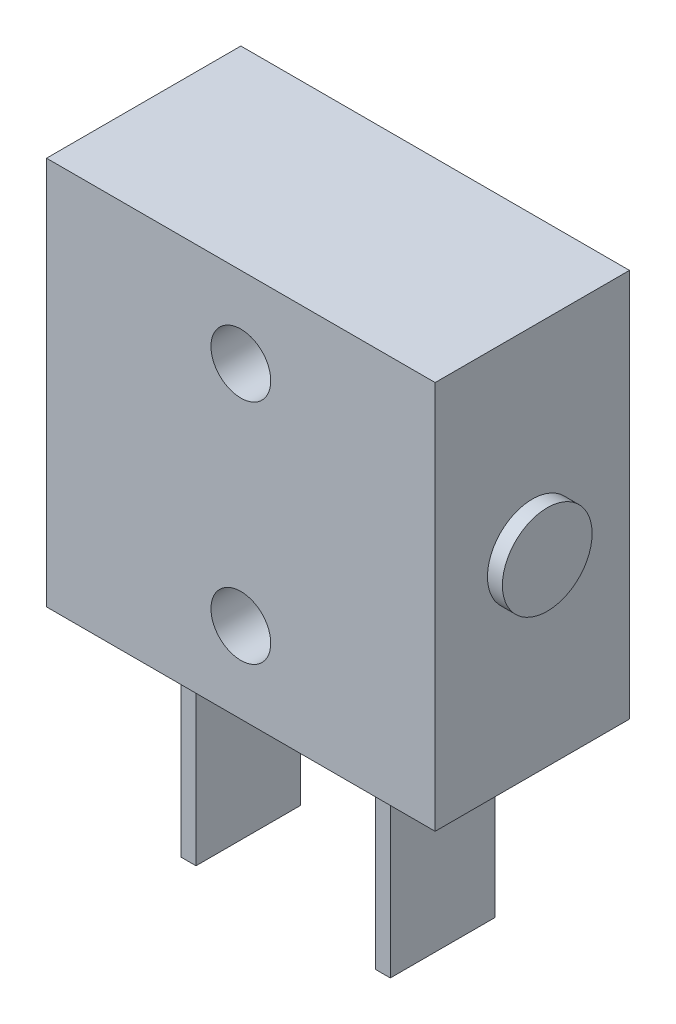
ISO-10303-21;
HEADER;
FILE_DESCRIPTION(('STEP AP214'),'2;1');
FILE_NAME('part.step','',(''),(''),'','','');
FILE_SCHEMA(('AUTOMOTIVE_DESIGN { 1 0 10303 214 1 1 1 1 }'));
ENDSEC;
DATA;
#1=APPLICATION_CONTEXT('core data for automotive mechanical design processes');
#2=APPLICATION_PROTOCOL_DEFINITION('international standard','automotive_design',2000,#1);
#3=PRODUCT_CONTEXT('',#1,'mechanical');
#4=PRODUCT('Part','Part','',(#3));
#5=PRODUCT_RELATED_PRODUCT_CATEGORY('part','',(#4));
#6=PRODUCT_DEFINITION_FORMATION('','',#4);
#7=PRODUCT_DEFINITION_CONTEXT('part definition',#1,'design');
#8=PRODUCT_DEFINITION('design','',#6,#7);
#9=PRODUCT_DEFINITION_SHAPE('','',#8);
#10=(LENGTH_UNIT() NAMED_UNIT(*) SI_UNIT(.MILLI.,.METRE.));
#11=(NAMED_UNIT(*) PLANE_ANGLE_UNIT() SI_UNIT($,.RADIAN.));
#12=(NAMED_UNIT(*) SI_UNIT($,.STERADIAN.) SOLID_ANGLE_UNIT());
#13=UNCERTAINTY_MEASURE_WITH_UNIT(LENGTH_MEASURE(1.E-05),#10,'distance_accuracy_value','');
#14=(GEOMETRIC_REPRESENTATION_CONTEXT(3) GLOBAL_UNCERTAINTY_ASSIGNED_CONTEXT((#13)) GLOBAL_UNIT_ASSIGNED_CONTEXT((#10,
#11,#12)) REPRESENTATION_CONTEXT('',''));
#15=CARTESIAN_POINT('',(0.,0.,0.));
#16=DIRECTION('',(0.,0.,1.));
#17=DIRECTION('',(1.,0.,0.));
#18=AXIS2_PLACEMENT_3D('',#15,#16,#17);
#19=CARTESIAN_POINT('',(-6.5,-6.5,6.5));
#20=DIRECTION('',(0.,1.,0.));
#21=DIRECTION('',(0.,0.,1.));
#22=AXIS2_PLACEMENT_3D('',#19,#20,#21);
#23=PLANE('',#22);
#24=DIRECTION('',(0.,0.,1.));
#25=VECTOR('',#24,1.);
#26=CARTESIAN_POINT('',(-3.,-6.5,5.));
#27=LINE('',#26,#25);
#28=CARTESIAN_POINT('',(-3.,-6.5,1.5));
#29=VERTEX_POINT('',#28);
#30=CARTESIAN_POINT('',(-3.,-6.5,5.));
#31=VERTEX_POINT('',#30);
#32=EDGE_CURVE('E147',#29,#31,#27,.T.);
#33=ORIENTED_EDGE('',*,*,#32,.F.);
#34=DIRECTION('',(1.,0.,0.));
#35=VECTOR('',#34,1.);
#36=CARTESIAN_POINT('',(-3.5,-6.5,1.5));
#37=LINE('',#36,#35);
#38=CARTESIAN_POINT('',(-3.5,-6.5,1.5));
#39=VERTEX_POINT('',#38);
#40=EDGE_CURVE('E160',#39,#29,#37,.T.);
#41=ORIENTED_EDGE('',*,*,#40,.F.);
#42=DIRECTION('',(0.,0.,-1.));
#43=VECTOR('',#42,1.);
#44=CARTESIAN_POINT('',(-3.5,-6.5,5.));
#45=LINE('',#44,#43);
#46=CARTESIAN_POINT('',(-3.5,-6.5,5.));
#47=VERTEX_POINT('',#46);
#48=EDGE_CURVE('E169',#47,#39,#45,.T.);
#49=ORIENTED_EDGE('',*,*,#48,.F.);
#50=DIRECTION('',(-1.,0.,0.));
#51=VECTOR('',#50,1.);
#52=CARTESIAN_POINT('',(-3.5,-6.5,5.));
#53=LINE('',#52,#51);
#54=EDGE_CURVE('E150',#31,#47,#53,.T.);
#55=ORIENTED_EDGE('',*,*,#54,.F.);
#56=EDGE_LOOP('',(#33,#41,#49,#55));
#57=FACE_BOUND('',#56,.T.);
#58=DIRECTION('',(1.,0.,0.));
#59=VECTOR('',#58,1.);
#60=CARTESIAN_POINT('',(-6.5,-6.5,0.));
#61=LINE('',#60,#59);
#62=CARTESIAN_POINT('',(-6.5,-6.5,0.));
#63=VERTEX_POINT('',#62);
#64=CARTESIAN_POINT('',(6.5,-6.5,0.));
#65=VERTEX_POINT('',#64);
#66=EDGE_CURVE('E190',#63,#65,#61,.T.);
#67=ORIENTED_EDGE('',*,*,#66,.T.);
#68=DIRECTION('',(0.,0.,-1.));
#69=VECTOR('',#68,1.);
#70=CARTESIAN_POINT('',(6.5,-6.5,6.5));
#71=LINE('',#70,#69);
#72=CARTESIAN_POINT('',(6.5,-6.5,6.5));
#73=VERTEX_POINT('',#72);
#74=EDGE_CURVE('E196',#73,#65,#71,.T.);
#75=ORIENTED_EDGE('',*,*,#74,.F.);
#76=DIRECTION('',(1.,0.,0.));
#77=VECTOR('',#76,1.);
#78=CARTESIAN_POINT('',(-6.5,-6.5,6.5));
#79=LINE('',#78,#77);
#80=CARTESIAN_POINT('',(-6.5,-6.5,6.5));
#81=VERTEX_POINT('',#80);
#82=EDGE_CURVE('E194',#81,#73,#79,.T.);
#83=ORIENTED_EDGE('',*,*,#82,.F.);
#84=DIRECTION('',(0.,0.,-1.));
#85=VECTOR('',#84,1.);
#86=CARTESIAN_POINT('',(-6.5,-6.5,6.5));
#87=LINE('',#86,#85);
#88=EDGE_CURVE('E206',#81,#63,#87,.T.);
#89=ORIENTED_EDGE('',*,*,#88,.T.);
#90=EDGE_LOOP('',(#67,#75,#83,#89));
#91=FACE_BOUND('',#90,.T.);
#92=DIRECTION('',(0.,0.,1.));
#93=VECTOR('',#92,1.);
#94=CARTESIAN_POINT('',(3.5,-6.5,5.));
#95=LINE('',#94,#93);
#96=CARTESIAN_POINT('',(3.5,-6.5,1.5));
#97=VERTEX_POINT('',#96);
#98=CARTESIAN_POINT('',(3.5,-6.5,5.));
#99=VERTEX_POINT('',#98);
#100=EDGE_CURVE('E146',#97,#99,#95,.T.);
#101=ORIENTED_EDGE('',*,*,#100,.F.);
#102=DIRECTION('',(1.,0.,0.));
#103=VECTOR('',#102,1.);
#104=CARTESIAN_POINT('',(3.5,-6.5,1.5));
#105=LINE('',#104,#103);
#106=CARTESIAN_POINT('',(3.,-6.5,1.5));
#107=VERTEX_POINT('',#106);
#108=EDGE_CURVE('E143',#107,#97,#105,.T.);
#109=ORIENTED_EDGE('',*,*,#108,.F.);
#110=DIRECTION('',(0.,0.,-1.));
#111=VECTOR('',#110,1.);
#112=CARTESIAN_POINT('',(3.,-6.5,5.));
#113=LINE('',#112,#111);
#114=CARTESIAN_POINT('',(3.,-6.5,5.));
#115=VERTEX_POINT('',#114);
#116=EDGE_CURVE('E57',#115,#107,#113,.T.);
#117=ORIENTED_EDGE('',*,*,#116,.F.);
#118=DIRECTION('',(-1.,0.,0.));
#119=VECTOR('',#118,1.);
#120=CARTESIAN_POINT('',(3.5,-6.5,5.));
#121=LINE('',#120,#119);
#122=EDGE_CURVE('E52',#99,#115,#121,.T.);
#123=ORIENTED_EDGE('',*,*,#122,.F.);
#124=EDGE_LOOP('',(#101,#109,#117,#123));
#125=FACE_BOUND('',#124,.T.);
#126=ADVANCED_FACE('F37',(#57,#91,#125),#23,.F.);
#127=CARTESIAN_POINT('',(6.5,6.5,6.5));
#128=DIRECTION('',(-1.,0.,0.));
#129=DIRECTION('',(0.,-1.,0.));
#130=AXIS2_PLACEMENT_3D('',#127,#128,#129);
#131=PLANE('',#130);
#132=CARTESIAN_POINT('',(6.5,0.,3.25));
#133=DIRECTION('',(-1.,0.,0.));
#134=DIRECTION('',(0.,-1.,0.));
#135=AXIS2_PLACEMENT_3D('',#132,#133,#134);
#136=CIRCLE('',#135,1.5);
#137=CARTESIAN_POINT('',(6.5,-1.5,3.25));
#138=VERTEX_POINT('',#137);
#139=EDGE_CURVE('E11',#138,#138,#136,.F.);
#140=ORIENTED_EDGE('',*,*,#139,.F.);
#141=EDGE_LOOP('',(#140));
#142=FACE_BOUND('',#141,.T.);
#143=DIRECTION('',(0.,1.,0.));
#144=VECTOR('',#143,1.);
#145=CARTESIAN_POINT('',(6.5,6.5,0.));
#146=LINE('',#145,#144);
#147=CARTESIAN_POINT('',(6.5,6.5,0.));
#148=VERTEX_POINT('',#147);
#149=EDGE_CURVE('E185',#65,#148,#146,.T.);
#150=ORIENTED_EDGE('',*,*,#149,.T.);
#151=DIRECTION('',(0.,0.,-1.));
#152=VECTOR('',#151,1.);
#153=CARTESIAN_POINT('',(6.5,6.5,6.5));
#154=LINE('',#153,#152);
#155=CARTESIAN_POINT('',(6.5,6.5,6.5));
#156=VERTEX_POINT('',#155);
#157=EDGE_CURVE('E45',#156,#148,#154,.T.);
#158=ORIENTED_EDGE('',*,*,#157,.F.);
#159=DIRECTION('',(0.,1.,0.));
#160=VECTOR('',#159,1.);
#161=CARTESIAN_POINT('',(6.5,6.5,6.5));
#162=LINE('',#161,#160);
#163=EDGE_CURVE('E186',#73,#156,#162,.T.);
#164=ORIENTED_EDGE('',*,*,#163,.F.);
#165=ORIENTED_EDGE('',*,*,#74,.T.);
#166=EDGE_LOOP('',(#150,#158,#164,#165));
#167=FACE_BOUND('',#166,.T.);
#168=ADVANCED_FACE('F39',(#142,#167),#131,.F.);
#169=CARTESIAN_POINT('',(-6.5,6.5,6.5));
#170=DIRECTION('',(0.,-1.,0.));
#171=DIRECTION('',(0.,0.,-1.));
#172=AXIS2_PLACEMENT_3D('',#169,#170,#171);
#173=PLANE('',#172);
#174=DIRECTION('',(-1.,0.,0.));
#175=VECTOR('',#174,1.);
#176=CARTESIAN_POINT('',(-6.5,6.5,0.));
#177=LINE('',#176,#175);
#178=CARTESIAN_POINT('',(-6.5,6.5,0.));
#179=VERTEX_POINT('',#178);
#180=EDGE_CURVE('E199',#148,#179,#177,.T.);
#181=ORIENTED_EDGE('',*,*,#180,.T.);
#182=DIRECTION('',(0.,0.,-1.));
#183=VECTOR('',#182,1.);
#184=CARTESIAN_POINT('',(-6.5,6.5,6.5));
#185=LINE('',#184,#183);
#186=CARTESIAN_POINT('',(-6.5,6.5,6.5));
#187=VERTEX_POINT('',#186);
#188=EDGE_CURVE('E209',#187,#179,#185,.T.);
#189=ORIENTED_EDGE('',*,*,#188,.F.);
#190=DIRECTION('',(-1.,0.,0.));
#191=VECTOR('',#190,1.);
#192=CARTESIAN_POINT('',(-6.5,6.5,6.5));
#193=LINE('',#192,#191);
#194=EDGE_CURVE('E189',#156,#187,#193,.T.);
#195=ORIENTED_EDGE('',*,*,#194,.F.);
#196=ORIENTED_EDGE('',*,*,#157,.T.);
#197=EDGE_LOOP('',(#181,#189,#195,#196));
#198=FACE_BOUND('',#197,.T.);
#199=ADVANCED_FACE('F214',(#198),#173,.F.);
#200=CARTESIAN_POINT('',(-6.5,6.5,6.5));
#201=DIRECTION('',(1.,0.,0.));
#202=DIRECTION('',(0.,1.,0.));
#203=AXIS2_PLACEMENT_3D('',#200,#201,#202);
#204=PLANE('',#203);
#205=DIRECTION('',(0.,-1.,0.));
#206=VECTOR('',#205,1.);
#207=CARTESIAN_POINT('',(-6.5,6.5,0.));
#208=LINE('',#207,#206);
#209=EDGE_CURVE('E201',#179,#63,#208,.T.);
#210=ORIENTED_EDGE('',*,*,#209,.T.);
#211=ORIENTED_EDGE('',*,*,#88,.F.);
#212=DIRECTION('',(0.,-1.,0.));
#213=VECTOR('',#212,1.);
#214=CARTESIAN_POINT('',(-6.5,6.5,6.5));
#215=LINE('',#214,#213);
#216=EDGE_CURVE('E192',#187,#81,#215,.T.);
#217=ORIENTED_EDGE('',*,*,#216,.F.);
#218=ORIENTED_EDGE('',*,*,#188,.T.);
#219=EDGE_LOOP('',(#210,#211,#217,#218));
#220=FACE_BOUND('',#219,.T.);
#221=ADVANCED_FACE('F226',(#220),#204,.F.);
#222=CARTESIAN_POINT('',(0.,0.,6.5));
#223=DIRECTION('',(0.,0.,1.));
#224=DIRECTION('',(1.,0.,0.));
#225=AXIS2_PLACEMENT_3D('',#222,#223,#224);
#226=PLANE('',#225);
#227=CARTESIAN_POINT('',(0.,-3.8,6.5));
#228=DIRECTION('',(0.,0.,1.));
#229=DIRECTION('',(-1.,0.,0.));
#230=AXIS2_PLACEMENT_3D('',#227,#228,#229);
#231=CIRCLE('',#230,1.);
#232=CARTESIAN_POINT('',(1.,-3.8,6.5));
#233=VERTEX_POINT('',#232);
#234=EDGE_CURVE('E414',#233,#233,#231,.T.);
#235=ORIENTED_EDGE('',*,*,#234,.F.);
#236=EDGE_LOOP('',(#235));
#237=FACE_BOUND('',#236,.T.);
#238=CARTESIAN_POINT('',(0.,3.8,6.5));
#239=DIRECTION('',(0.,0.,1.));
#240=DIRECTION('',(1.,0.,0.));
#241=AXIS2_PLACEMENT_3D('',#238,#239,#240);
#242=CIRCLE('',#241,1.);
#243=CARTESIAN_POINT('',(1.,3.8,6.5));
#244=VERTEX_POINT('',#243);
#245=EDGE_CURVE('E421',#244,#244,#242,.T.);
#246=ORIENTED_EDGE('',*,*,#245,.F.);
#247=EDGE_LOOP('',(#246));
#248=FACE_BOUND('',#247,.T.);
#249=ORIENTED_EDGE('',*,*,#163,.T.);
#250=ORIENTED_EDGE('',*,*,#194,.T.);
#251=ORIENTED_EDGE('',*,*,#216,.T.);
#252=ORIENTED_EDGE('',*,*,#82,.T.);
#253=EDGE_LOOP('',(#249,#250,#251,#252));
#254=FACE_BOUND('',#253,.T.);
#255=ADVANCED_FACE('F231',(#237,#248,#254),#226,.T.);
#256=CARTESIAN_POINT('',(0.,0.,0.));
#257=DIRECTION('',(0.,0.,1.));
#258=DIRECTION('',(1.,0.,0.));
#259=AXIS2_PLACEMENT_3D('',#256,#257,#258);
#260=PLANE('',#259);
#261=CARTESIAN_POINT('',(0.,-3.8,0.));
#262=DIRECTION('',(0.,0.,1.));
#263=DIRECTION('',(-1.,0.,0.));
#264=AXIS2_PLACEMENT_3D('',#261,#262,#263);
#265=CIRCLE('',#264,1.);
#266=CARTESIAN_POINT('',(1.,-3.8,0.));
#267=VERTEX_POINT('',#266);
#268=EDGE_CURVE('E417',#267,#267,#265,.T.);
#269=ORIENTED_EDGE('',*,*,#268,.T.);
#270=EDGE_LOOP('',(#269));
#271=FACE_BOUND('',#270,.T.);
#272=CARTESIAN_POINT('',(0.,3.8,0.));
#273=DIRECTION('',(0.,0.,1.));
#274=DIRECTION('',(1.,0.,0.));
#275=AXIS2_PLACEMENT_3D('',#272,#273,#274);
#276=CIRCLE('',#275,1.);
#277=CARTESIAN_POINT('',(1.,3.8,0.));
#278=VERTEX_POINT('',#277);
#279=EDGE_CURVE('E423',#278,#278,#276,.T.);
#280=ORIENTED_EDGE('',*,*,#279,.T.);
#281=EDGE_LOOP('',(#280));
#282=FACE_BOUND('',#281,.T.);
#283=ORIENTED_EDGE('',*,*,#149,.F.);
#284=ORIENTED_EDGE('',*,*,#66,.F.);
#285=ORIENTED_EDGE('',*,*,#209,.F.);
#286=ORIENTED_EDGE('',*,*,#180,.F.);
#287=EDGE_LOOP('',(#283,#284,#285,#286));
#288=FACE_BOUND('',#287,.T.);
#289=ADVANCED_FACE('F222',(#271,#282,#288),#260,.F.);
#290=CARTESIAN_POINT('',(-3.,-13.,5.));
#291=DIRECTION('',(-1.,0.,0.));
#292=DIRECTION('',(0.,0.,1.));
#293=AXIS2_PLACEMENT_3D('',#290,#291,#292);
#294=PLANE('',#293);
#295=ORIENTED_EDGE('',*,*,#32,.T.);
#296=DIRECTION('',(0.,1.,0.));
#297=VECTOR('',#296,1.);
#298=CARTESIAN_POINT('',(-3.,-13.,5.));
#299=LINE('',#298,#297);
#300=CARTESIAN_POINT('',(-3.,-13.,5.));
#301=VERTEX_POINT('',#300);
#302=EDGE_CURVE('E182',#301,#31,#299,.T.);
#303=ORIENTED_EDGE('',*,*,#302,.F.);
#304=DIRECTION('',(0.,0.,1.));
#305=VECTOR('',#304,1.);
#306=CARTESIAN_POINT('',(-3.,-13.,5.));
#307=LINE('',#306,#305);
#308=CARTESIAN_POINT('',(-3.,-13.,1.5));
#309=VERTEX_POINT('',#308);
#310=EDGE_CURVE('E156',#309,#301,#307,.T.);
#311=ORIENTED_EDGE('',*,*,#310,.F.);
#312=DIRECTION('',(0.,1.,0.));
#313=VECTOR('',#312,1.);
#314=CARTESIAN_POINT('',(-3.,-13.,1.5));
#315=LINE('',#314,#313);
#316=EDGE_CURVE('E165',#309,#29,#315,.T.);
#317=ORIENTED_EDGE('',*,*,#316,.T.);
#318=EDGE_LOOP('',(#295,#303,#311,#317));
#319=FACE_BOUND('',#318,.T.);
#320=ADVANCED_FACE('F239',(#319),#294,.F.);
#321=CARTESIAN_POINT('',(-3.5,-13.,5.));
#322=DIRECTION('',(0.,0.,-1.));
#323=DIRECTION('',(-1.,0.,0.));
#324=AXIS2_PLACEMENT_3D('',#321,#322,#323);
#325=PLANE('',#324);
#326=ORIENTED_EDGE('',*,*,#54,.T.);
#327=DIRECTION('',(0.,1.,0.));
#328=VECTOR('',#327,1.);
#329=CARTESIAN_POINT('',(-3.5,-13.,5.));
#330=LINE('',#329,#328);
#331=CARTESIAN_POINT('',(-3.5,-13.,5.));
#332=VERTEX_POINT('',#331);
#333=EDGE_CURVE('E179',#332,#47,#330,.T.);
#334=ORIENTED_EDGE('',*,*,#333,.F.);
#335=DIRECTION('',(-1.,0.,0.));
#336=VECTOR('',#335,1.);
#337=CARTESIAN_POINT('',(-3.5,-13.,5.));
#338=LINE('',#337,#336);
#339=EDGE_CURVE('E159',#301,#332,#338,.T.);
#340=ORIENTED_EDGE('',*,*,#339,.F.);
#341=ORIENTED_EDGE('',*,*,#302,.T.);
#342=EDGE_LOOP('',(#326,#334,#340,#341));
#343=FACE_BOUND('',#342,.T.);
#344=ADVANCED_FACE('F282',(#343),#325,.F.);
#345=CARTESIAN_POINT('',(-3.5,-13.,5.));
#346=DIRECTION('',(1.,0.,0.));
#347=DIRECTION('',(0.,0.,-1.));
#348=AXIS2_PLACEMENT_3D('',#345,#346,#347);
#349=PLANE('',#348);
#350=ORIENTED_EDGE('',*,*,#48,.T.);
#351=DIRECTION('',(0.,1.,0.));
#352=VECTOR('',#351,1.);
#353=CARTESIAN_POINT('',(-3.5,-13.,1.5));
#354=LINE('',#353,#352);
#355=CARTESIAN_POINT('',(-3.5,-13.,1.5));
#356=VERTEX_POINT('',#355);
#357=EDGE_CURVE('E176',#356,#39,#354,.T.);
#358=ORIENTED_EDGE('',*,*,#357,.F.);
#359=DIRECTION('',(0.,0.,-1.));
#360=VECTOR('',#359,1.);
#361=CARTESIAN_POINT('',(-3.5,-13.,5.));
#362=LINE('',#361,#360);
#363=EDGE_CURVE('E162',#332,#356,#362,.T.);
#364=ORIENTED_EDGE('',*,*,#363,.F.);
#365=ORIENTED_EDGE('',*,*,#333,.T.);
#366=EDGE_LOOP('',(#350,#358,#364,#365));
#367=FACE_BOUND('',#366,.T.);
#368=ADVANCED_FACE('F289',(#367),#349,.F.);
#369=CARTESIAN_POINT('',(-3.5,-13.,1.5));
#370=DIRECTION('',(0.,0.,1.));
#371=DIRECTION('',(1.,0.,0.));
#372=AXIS2_PLACEMENT_3D('',#369,#370,#371);
#373=PLANE('',#372);
#374=ORIENTED_EDGE('',*,*,#40,.T.);
#375=ORIENTED_EDGE('',*,*,#316,.F.);
#376=DIRECTION('',(1.,0.,0.));
#377=VECTOR('',#376,1.);
#378=CARTESIAN_POINT('',(-3.5,-13.,1.5));
#379=LINE('',#378,#377);
#380=EDGE_CURVE('E164',#356,#309,#379,.T.);
#381=ORIENTED_EDGE('',*,*,#380,.F.);
#382=ORIENTED_EDGE('',*,*,#357,.T.);
#383=EDGE_LOOP('',(#374,#375,#381,#382));
#384=FACE_BOUND('',#383,.T.);
#385=ADVANCED_FACE('F297',(#384),#373,.F.);
#386=CARTESIAN_POINT('',(0.,-13.,0.));
#387=DIRECTION('',(0.,-1.,0.));
#388=DIRECTION('',(0.,0.,-1.));
#389=AXIS2_PLACEMENT_3D('',#386,#387,#388);
#390=PLANE('',#389);
#391=ORIENTED_EDGE('',*,*,#310,.T.);
#392=ORIENTED_EDGE('',*,*,#339,.T.);
#393=ORIENTED_EDGE('',*,*,#363,.T.);
#394=ORIENTED_EDGE('',*,*,#380,.T.);
#395=EDGE_LOOP('',(#391,#392,#393,#394));
#396=FACE_BOUND('',#395,.T.);
#397=ADVANCED_FACE('F305',(#396),#390,.T.);
#398=CARTESIAN_POINT('',(3.5,-13.,5.));
#399=DIRECTION('',(-1.,0.,0.));
#400=DIRECTION('',(0.,0.,1.));
#401=AXIS2_PLACEMENT_3D('',#398,#399,#400);
#402=PLANE('',#401);
#403=ORIENTED_EDGE('',*,*,#100,.T.);
#404=DIRECTION('',(0.,1.,0.));
#405=VECTOR('',#404,1.);
#406=CARTESIAN_POINT('',(3.5,-13.,5.));
#407=LINE('',#406,#405);
#408=CARTESIAN_POINT('',(3.5,-13.,5.));
#409=VERTEX_POINT('',#408);
#410=EDGE_CURVE('E127',#409,#99,#407,.T.);
#411=ORIENTED_EDGE('',*,*,#410,.F.);
#412=DIRECTION('',(0.,0.,1.));
#413=VECTOR('',#412,1.);
#414=CARTESIAN_POINT('',(3.5,-13.,5.));
#415=LINE('',#414,#413);
#416=CARTESIAN_POINT('',(3.5,-13.,1.5));
#417=VERTEX_POINT('',#416);
#418=EDGE_CURVE('E134',#417,#409,#415,.T.);
#419=ORIENTED_EDGE('',*,*,#418,.F.);
#420=DIRECTION('',(0.,1.,0.));
#421=VECTOR('',#420,1.);
#422=CARTESIAN_POINT('',(3.5,-13.,1.5));
#423=LINE('',#422,#421);
#424=EDGE_CURVE('E430',#417,#97,#423,.T.);
#425=ORIENTED_EDGE('',*,*,#424,.T.);
#426=EDGE_LOOP('',(#403,#411,#419,#425));
#427=FACE_BOUND('',#426,.T.);
#428=ADVANCED_FACE('F145',(#427),#402,.F.);
#429=CARTESIAN_POINT('',(3.5,-13.,5.));
#430=DIRECTION('',(0.,0.,-1.));
#431=DIRECTION('',(-1.,0.,0.));
#432=AXIS2_PLACEMENT_3D('',#429,#430,#431);
#433=PLANE('',#432);
#434=ORIENTED_EDGE('',*,*,#122,.T.);
#435=DIRECTION('',(0.,1.,0.));
#436=VECTOR('',#435,1.);
#437=CARTESIAN_POINT('',(3.,-13.,5.));
#438=LINE('',#437,#436);
#439=CARTESIAN_POINT('',(3.,-13.,5.));
#440=VERTEX_POINT('',#439);
#441=EDGE_CURVE('E130',#440,#115,#438,.T.);
#442=ORIENTED_EDGE('',*,*,#441,.F.);
#443=DIRECTION('',(-1.,0.,0.));
#444=VECTOR('',#443,1.);
#445=CARTESIAN_POINT('',(3.5,-13.,5.));
#446=LINE('',#445,#444);
#447=EDGE_CURVE('E123',#409,#440,#446,.T.);
#448=ORIENTED_EDGE('',*,*,#447,.F.);
#449=ORIENTED_EDGE('',*,*,#410,.T.);
#450=EDGE_LOOP('',(#434,#442,#448,#449));
#451=FACE_BOUND('',#450,.T.);
#452=ADVANCED_FACE('F125',(#451),#433,.F.);
#453=CARTESIAN_POINT('',(3.,-13.,5.));
#454=DIRECTION('',(1.,0.,0.));
#455=DIRECTION('',(0.,0.,-1.));
#456=AXIS2_PLACEMENT_3D('',#453,#454,#455);
#457=PLANE('',#456);
#458=ORIENTED_EDGE('',*,*,#116,.T.);
#459=DIRECTION('',(0.,1.,0.));
#460=VECTOR('',#459,1.);
#461=CARTESIAN_POINT('',(3.,-13.,1.5));
#462=LINE('',#461,#460);
#463=CARTESIAN_POINT('',(3.,-13.,1.5));
#464=VERTEX_POINT('',#463);
#465=EDGE_CURVE('E152',#464,#107,#462,.T.);
#466=ORIENTED_EDGE('',*,*,#465,.F.);
#467=DIRECTION('',(0.,0.,-1.));
#468=VECTOR('',#467,1.);
#469=CARTESIAN_POINT('',(3.,-13.,5.));
#470=LINE('',#469,#468);
#471=EDGE_CURVE('E133',#440,#464,#470,.T.);
#472=ORIENTED_EDGE('',*,*,#471,.F.);
#473=ORIENTED_EDGE('',*,*,#441,.T.);
#474=EDGE_LOOP('',(#458,#466,#472,#473));
#475=FACE_BOUND('',#474,.T.);
#476=ADVANCED_FACE('F326',(#475),#457,.F.);
#477=CARTESIAN_POINT('',(3.5,-13.,1.5));
#478=DIRECTION('',(0.,0.,1.));
#479=DIRECTION('',(1.,0.,0.));
#480=AXIS2_PLACEMENT_3D('',#477,#478,#479);
#481=PLANE('',#480);
#482=ORIENTED_EDGE('',*,*,#108,.T.);
#483=ORIENTED_EDGE('',*,*,#424,.F.);
#484=DIRECTION('',(1.,0.,0.));
#485=VECTOR('',#484,1.);
#486=CARTESIAN_POINT('',(3.5,-13.,1.5));
#487=LINE('',#486,#485);
#488=EDGE_CURVE('E139',#464,#417,#487,.T.);
#489=ORIENTED_EDGE('',*,*,#488,.F.);
#490=ORIENTED_EDGE('',*,*,#465,.T.);
#491=EDGE_LOOP('',(#482,#483,#489,#490));
#492=FACE_BOUND('',#491,.T.);
#493=ADVANCED_FACE('F333',(#492),#481,.F.);
#494=CARTESIAN_POINT('',(0.,-13.,0.));
#495=DIRECTION('',(0.,1.,0.));
#496=DIRECTION('',(0.,0.,1.));
#497=AXIS2_PLACEMENT_3D('',#494,#495,#496);
#498=PLANE('',#497);
#499=ORIENTED_EDGE('',*,*,#418,.T.);
#500=ORIENTED_EDGE('',*,*,#447,.T.);
#501=ORIENTED_EDGE('',*,*,#471,.T.);
#502=ORIENTED_EDGE('',*,*,#488,.T.);
#503=EDGE_LOOP('',(#499,#500,#501,#502));
#504=FACE_BOUND('',#503,.T.);
#505=ADVANCED_FACE('F137',(#504),#498,.F.);
#506=CARTESIAN_POINT('',(0.,3.8,0.));
#507=DIRECTION('',(0.,0.,1.));
#508=DIRECTION('',(1.,0.,0.));
#509=AXIS2_PLACEMENT_3D('',#506,#507,#508);
#510=CYLINDRICAL_SURFACE('',#509,1.);
#511=CARTESIAN_POINT('',(1.,3.8,0.));
#512=CARTESIAN_POINT('',(1.,3.8,0.0677083333333332));
#513=CARTESIAN_POINT('',(1.,3.8,0.135416666666667));
#514=CARTESIAN_POINT('',(1.,3.8,0.270833333333333));
#515=CARTESIAN_POINT('',(1.,3.8,0.338541666666667));
#516=CARTESIAN_POINT('',(1.,3.8,0.473958333333333));
#517=CARTESIAN_POINT('',(1.,3.8,0.541666666666667));
#518=CARTESIAN_POINT('',(1.,3.8,0.677083333333333));
#519=CARTESIAN_POINT('',(1.,3.8,0.744791666666667));
#520=CARTESIAN_POINT('',(1.,3.8,0.880208333333333));
#521=CARTESIAN_POINT('',(1.,3.8,0.947916666666667));
#522=CARTESIAN_POINT('',(1.,3.8,1.08333333333333));
#523=CARTESIAN_POINT('',(1.,3.8,1.15104166666667));
#524=CARTESIAN_POINT('',(1.,3.8,1.28645833333333));
#525=CARTESIAN_POINT('',(1.,3.8,1.35416666666667));
#526=CARTESIAN_POINT('',(1.,3.8,1.48958333333333));
#527=CARTESIAN_POINT('',(1.,3.8,1.55729166666667));
#528=CARTESIAN_POINT('',(1.,3.8,1.69270833333333));
#529=CARTESIAN_POINT('',(1.,3.8,1.76041666666667));
#530=CARTESIAN_POINT('',(1.,3.8,1.89583333333333));
#531=CARTESIAN_POINT('',(1.,3.8,1.96354166666667));
#532=CARTESIAN_POINT('',(1.,3.8,2.09895833333333));
#533=CARTESIAN_POINT('',(1.,3.8,2.16666666666667));
#534=CARTESIAN_POINT('',(1.,3.8,2.30208333333333));
#535=CARTESIAN_POINT('',(1.,3.8,2.36979166666667));
#536=CARTESIAN_POINT('',(1.,3.8,2.50520833333333));
#537=CARTESIAN_POINT('',(1.,3.8,2.57291666666667));
#538=CARTESIAN_POINT('',(1.,3.8,2.70833333333333));
#539=CARTESIAN_POINT('',(1.,3.8,2.77604166666667));
#540=CARTESIAN_POINT('',(1.,3.8,2.91145833333333));
#541=CARTESIAN_POINT('',(1.,3.8,2.97916666666667));
#542=CARTESIAN_POINT('',(1.,3.8,3.11458333333333));
#543=CARTESIAN_POINT('',(1.,3.8,3.18229166666667));
#544=CARTESIAN_POINT('',(1.,3.8,3.31770833333333));
#545=CARTESIAN_POINT('',(1.,3.8,3.38541666666667));
#546=CARTESIAN_POINT('',(1.,3.8,3.52083333333333));
#547=CARTESIAN_POINT('',(1.,3.8,3.58854166666667));
#548=CARTESIAN_POINT('',(1.,3.8,3.72395833333333));
#549=CARTESIAN_POINT('',(1.,3.8,3.79166666666667));
#550=CARTESIAN_POINT('',(1.,3.8,3.92708333333333));
#551=CARTESIAN_POINT('',(1.,3.8,3.99479166666667));
#552=CARTESIAN_POINT('',(1.,3.8,4.13020833333333));
#553=CARTESIAN_POINT('',(1.,3.8,4.19791666666667));
#554=CARTESIAN_POINT('',(1.,3.8,4.33333333333333));
#555=CARTESIAN_POINT('',(1.,3.8,4.40104166666667));
#556=CARTESIAN_POINT('',(1.,3.8,4.53645833333333));
#557=CARTESIAN_POINT('',(1.,3.8,4.60416666666667));
#558=CARTESIAN_POINT('',(1.,3.8,4.73958333333333));
#559=CARTESIAN_POINT('',(1.,3.8,4.80729166666667));
#560=CARTESIAN_POINT('',(1.,3.8,4.94270833333333));
#561=CARTESIAN_POINT('',(1.,3.8,5.01041666666667));
#562=CARTESIAN_POINT('',(1.,3.8,5.14583333333333));
#563=CARTESIAN_POINT('',(1.,3.8,5.21354166666667));
#564=CARTESIAN_POINT('',(1.,3.8,5.34895833333333));
#565=CARTESIAN_POINT('',(1.,3.8,5.41666666666667));
#566=CARTESIAN_POINT('',(1.,3.8,5.55208333333333));
#567=CARTESIAN_POINT('',(1.,3.8,5.61979166666667));
#568=CARTESIAN_POINT('',(1.,3.8,5.75520833333333));
#569=CARTESIAN_POINT('',(1.,3.8,5.82291666666667));
#570=CARTESIAN_POINT('',(1.,3.8,5.95833333333333));
#571=CARTESIAN_POINT('',(1.,3.8,6.02604166666667));
#572=CARTESIAN_POINT('',(1.,3.8,6.16145833333333));
#573=CARTESIAN_POINT('',(1.,3.8,6.22916666666667));
#574=CARTESIAN_POINT('',(1.,3.8,6.36458333333333));
#575=CARTESIAN_POINT('',(1.,3.8,6.43229166666667));
#576=CARTESIAN_POINT('',(1.,3.8,6.5));
#577=B_SPLINE_CURVE_WITH_KNOTS('',3,(#511,#512,#513,#514,#515,#516,#517,#518,#519,#520,#521,
#522,#523,#524,#525,#526,#527,#528,#529,#530,#531,#532,#533,#534,#535,#536,#537,#538,#539,#540,
#541,#542,#543,#544,#545,#546,#547,#548,#549,#550,#551,#552,#553,#554,#555,#556,#557,#558,#559,
#560,#561,#562,#563,#564,#565,#566,#567,#568,#569,#570,#571,#572,#573,#574,#575,#576),
.UNSPECIFIED.,.F.,.F.,(4,2,2,2,2,2,2,2,2,2,2,2,2,2,2,2,2,2,2,2,2,2,2,2,2,2,2,2,2,2,2,2,4),(0.,
0.203125,0.40625,0.609375,0.8125,1.015625,1.21875,1.421875,1.625,1.828125,2.03125,2.234375,
2.4375,2.640625,2.84375,3.046875,3.25,3.453125,3.65625,3.859375,4.0625,4.265625,4.46875,
4.671875,4.875,5.078125,5.28125,5.484375,5.6875,5.890625,6.09375,6.296875,6.5),.UNSPECIFIED.);
#578=EDGE_CURVE('BSEAM347',#278,#244,#577,.T.);
#579=ORIENTED_EDGE('',*,*,#279,.F.);
#580=ORIENTED_EDGE('',*,*,#245,.T.);
#581=ORIENTED_EDGE('',*,*,#578,.T.);
#582=ORIENTED_EDGE('',*,*,#578,.F.);
#583=EDGE_LOOP('',(#579,#581,#580,#582));
#584=FACE_BOUND('',#583,.T.);
#585=ADVANCED_FACE('F347',(#584),#510,.F.);
#586=CARTESIAN_POINT('',(0.,-3.8,0.));
#587=DIRECTION('',(0.,0.,1.));
#588=DIRECTION('',(1.,0.,0.));
#589=AXIS2_PLACEMENT_3D('',#586,#587,#588);
#590=CYLINDRICAL_SURFACE('',#589,1.);
#591=CARTESIAN_POINT('',(1.,-3.8,0.));
#592=CARTESIAN_POINT('',(1.,-3.8,0.0677083333333332));
#593=CARTESIAN_POINT('',(1.,-3.8,0.135416666666667));
#594=CARTESIAN_POINT('',(1.,-3.8,0.270833333333333));
#595=CARTESIAN_POINT('',(1.,-3.8,0.338541666666667));
#596=CARTESIAN_POINT('',(1.,-3.8,0.473958333333333));
#597=CARTESIAN_POINT('',(1.,-3.8,0.541666666666667));
#598=CARTESIAN_POINT('',(1.,-3.8,0.677083333333333));
#599=CARTESIAN_POINT('',(1.,-3.8,0.744791666666667));
#600=CARTESIAN_POINT('',(1.,-3.8,0.880208333333333));
#601=CARTESIAN_POINT('',(1.,-3.8,0.947916666666667));
#602=CARTESIAN_POINT('',(1.,-3.8,1.08333333333333));
#603=CARTESIAN_POINT('',(1.,-3.8,1.15104166666667));
#604=CARTESIAN_POINT('',(1.,-3.8,1.28645833333333));
#605=CARTESIAN_POINT('',(1.,-3.8,1.35416666666667));
#606=CARTESIAN_POINT('',(1.,-3.8,1.48958333333333));
#607=CARTESIAN_POINT('',(1.,-3.8,1.55729166666667));
#608=CARTESIAN_POINT('',(1.,-3.8,1.69270833333333));
#609=CARTESIAN_POINT('',(1.,-3.8,1.76041666666667));
#610=CARTESIAN_POINT('',(1.,-3.8,1.89583333333333));
#611=CARTESIAN_POINT('',(1.,-3.8,1.96354166666667));
#612=CARTESIAN_POINT('',(1.,-3.8,2.09895833333333));
#613=CARTESIAN_POINT('',(1.,-3.8,2.16666666666667));
#614=CARTESIAN_POINT('',(1.,-3.8,2.30208333333333));
#615=CARTESIAN_POINT('',(1.,-3.8,2.36979166666667));
#616=CARTESIAN_POINT('',(1.,-3.8,2.50520833333333));
#617=CARTESIAN_POINT('',(1.,-3.8,2.57291666666667));
#618=CARTESIAN_POINT('',(1.,-3.8,2.70833333333333));
#619=CARTESIAN_POINT('',(1.,-3.8,2.77604166666667));
#620=CARTESIAN_POINT('',(1.,-3.8,2.91145833333333));
#621=CARTESIAN_POINT('',(1.,-3.8,2.97916666666667));
#622=CARTESIAN_POINT('',(1.,-3.8,3.11458333333333));
#623=CARTESIAN_POINT('',(1.,-3.8,3.18229166666667));
#624=CARTESIAN_POINT('',(1.,-3.8,3.31770833333333));
#625=CARTESIAN_POINT('',(1.,-3.8,3.38541666666667));
#626=CARTESIAN_POINT('',(1.,-3.8,3.52083333333333));
#627=CARTESIAN_POINT('',(1.,-3.8,3.58854166666667));
#628=CARTESIAN_POINT('',(1.,-3.8,3.72395833333333));
#629=CARTESIAN_POINT('',(1.,-3.8,3.79166666666667));
#630=CARTESIAN_POINT('',(1.,-3.8,3.92708333333333));
#631=CARTESIAN_POINT('',(1.,-3.8,3.99479166666667));
#632=CARTESIAN_POINT('',(1.,-3.8,4.13020833333333));
#633=CARTESIAN_POINT('',(1.,-3.8,4.19791666666667));
#634=CARTESIAN_POINT('',(1.,-3.8,4.33333333333333));
#635=CARTESIAN_POINT('',(1.,-3.8,4.40104166666667));
#636=CARTESIAN_POINT('',(1.,-3.8,4.53645833333333));
#637=CARTESIAN_POINT('',(1.,-3.8,4.60416666666667));
#638=CARTESIAN_POINT('',(1.,-3.8,4.73958333333333));
#639=CARTESIAN_POINT('',(1.,-3.8,4.80729166666667));
#640=CARTESIAN_POINT('',(1.,-3.8,4.94270833333333));
#641=CARTESIAN_POINT('',(1.,-3.8,5.01041666666667));
#642=CARTESIAN_POINT('',(1.,-3.8,5.14583333333333));
#643=CARTESIAN_POINT('',(1.,-3.8,5.21354166666667));
#644=CARTESIAN_POINT('',(1.,-3.8,5.34895833333333));
#645=CARTESIAN_POINT('',(1.,-3.8,5.41666666666667));
#646=CARTESIAN_POINT('',(1.,-3.8,5.55208333333333));
#647=CARTESIAN_POINT('',(1.,-3.8,5.61979166666667));
#648=CARTESIAN_POINT('',(1.,-3.8,5.75520833333333));
#649=CARTESIAN_POINT('',(1.,-3.8,5.82291666666667));
#650=CARTESIAN_POINT('',(1.,-3.8,5.95833333333333));
#651=CARTESIAN_POINT('',(1.,-3.8,6.02604166666667));
#652=CARTESIAN_POINT('',(1.,-3.8,6.16145833333333));
#653=CARTESIAN_POINT('',(1.,-3.8,6.22916666666667));
#654=CARTESIAN_POINT('',(1.,-3.8,6.36458333333333));
#655=CARTESIAN_POINT('',(1.,-3.8,6.43229166666667));
#656=CARTESIAN_POINT('',(1.,-3.8,6.5));
#657=B_SPLINE_CURVE_WITH_KNOTS('',3,(#591,#592,#593,#594,#595,#596,#597,#598,#599,#600,#601,
#602,#603,#604,#605,#606,#607,#608,#609,#610,#611,#612,#613,#614,#615,#616,#617,#618,#619,#620,
#621,#622,#623,#624,#625,#626,#627,#628,#629,#630,#631,#632,#633,#634,#635,#636,#637,#638,#639,
#640,#641,#642,#643,#644,#645,#646,#647,#648,#649,#650,#651,#652,#653,#654,#655,#656),
.UNSPECIFIED.,.F.,.F.,(4,2,2,2,2,2,2,2,2,2,2,2,2,2,2,2,2,2,2,2,2,2,2,2,2,2,2,2,2,2,2,2,4),(0.,
0.203125,0.40625,0.609375,0.8125,1.015625,1.21875,1.421875,1.625,1.828125,2.03125,2.234375,
2.4375,2.640625,2.84375,3.046875,3.25,3.453125,3.65625,3.859375,4.0625,4.265625,4.46875,
4.671875,4.875,5.078125,5.28125,5.484375,5.6875,5.890625,6.09375,6.296875,6.5),.UNSPECIFIED.);
#658=EDGE_CURVE('BSEAM353',#267,#233,#657,.T.);
#659=ORIENTED_EDGE('',*,*,#268,.F.);
#660=ORIENTED_EDGE('',*,*,#234,.T.);
#661=ORIENTED_EDGE('',*,*,#658,.T.);
#662=ORIENTED_EDGE('',*,*,#658,.F.);
#663=EDGE_LOOP('',(#659,#661,#660,#662));
#664=FACE_BOUND('',#663,.T.);
#665=ADVANCED_FACE('F353',(#664),#590,.F.);
#666=CARTESIAN_POINT('',(7.,0.,3.25));
#667=DIRECTION('',(-1.,0.,0.));
#668=DIRECTION('',(0.,-1.,0.));
#669=AXIS2_PLACEMENT_3D('',#666,#667,#668);
#670=CYLINDRICAL_SURFACE('',#669,1.5);
#671=CARTESIAN_POINT('',(7.,0.,3.25));
#672=DIRECTION('',(1.,0.,0.));
#673=DIRECTION('',(0.,1.,0.));
#674=AXIS2_PLACEMENT_3D('',#671,#672,#673);
#675=CIRCLE('',#674,1.5);
#676=CARTESIAN_POINT('',(7.,1.5,3.25));
#677=VERTEX_POINT('',#676);
#678=EDGE_CURVE('E413',#677,#677,#675,.T.);
#679=ORIENTED_EDGE('',*,*,#678,.F.);
#680=EDGE_LOOP('',(#679));
#681=FACE_BOUND('',#680,.T.);
#682=ORIENTED_EDGE('',*,*,#139,.T.);
#683=EDGE_LOOP('',(#682));
#684=FACE_BOUND('',#683,.T.);
#685=ADVANCED_FACE('F361',(#681,#684),#670,.T.);
#686=CARTESIAN_POINT('',(7.,0.,3.25));
#687=DIRECTION('',(1.,0.,0.));
#688=DIRECTION('',(0.,1.,0.));
#689=AXIS2_PLACEMENT_3D('',#686,#687,#688);
#690=PLANE('',#689);
#691=ORIENTED_EDGE('',*,*,#678,.T.);
#692=EDGE_LOOP('',(#691));
#693=FACE_BOUND('',#692,.T.);
#694=ADVANCED_FACE('F369',(#693),#690,.T.);
#695=CLOSED_SHELL('',(#126,#168,#199,#221,#255,#289,#320,#344,#368,#385,#397,#428,#452,#476,
#493,#505,#585,#665,#685,#694));
#696=MANIFOLD_SOLID_BREP('B2',#695);
#697=ADVANCED_BREP_SHAPE_REPRESENTATION('',(#18,#696),#14);
#698=SHAPE_DEFINITION_REPRESENTATION(#9,#697);
ENDSEC;
END-ISO-10303-21;
